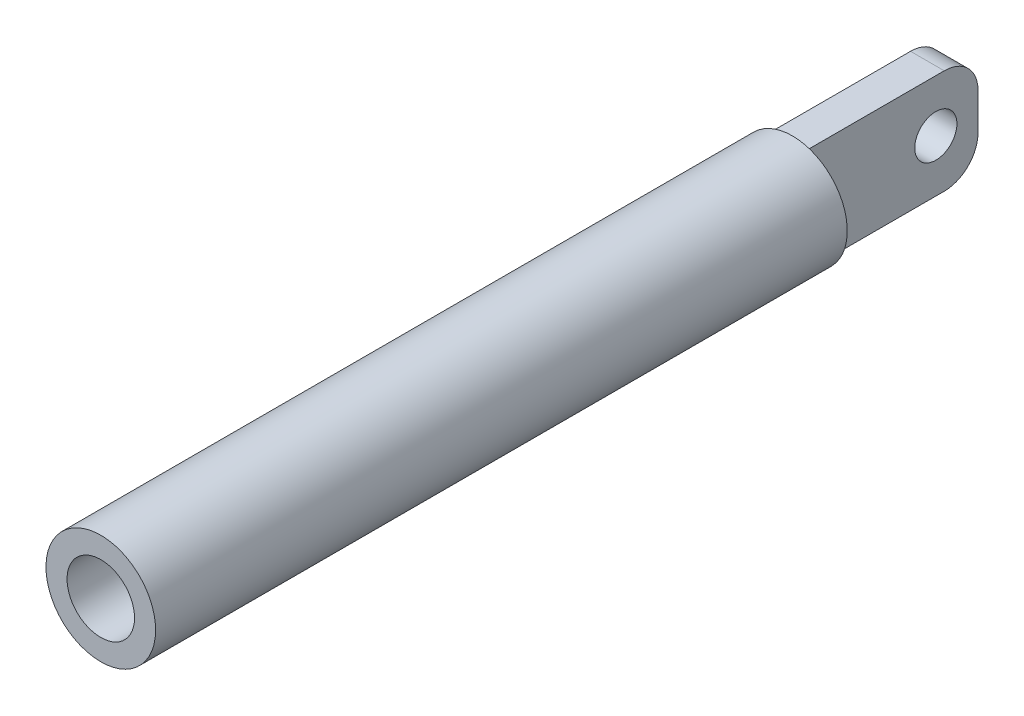
ISO-10303-21;
HEADER;
FILE_DESCRIPTION(('STEP AP214'),'2;1');
FILE_NAME('part.step','',(''),(''),'','','');
FILE_SCHEMA(('AUTOMOTIVE_DESIGN { 1 0 10303 214 1 1 1 1 }'));
ENDSEC;
DATA;
#1=APPLICATION_CONTEXT('core data for automotive mechanical design processes');
#2=APPLICATION_PROTOCOL_DEFINITION('international standard','automotive_design',2000,#1);
#3=PRODUCT_CONTEXT('',#1,'mechanical');
#4=PRODUCT('Part','Part','',(#3));
#5=PRODUCT_RELATED_PRODUCT_CATEGORY('part','',(#4));
#6=PRODUCT_DEFINITION_FORMATION('','',#4);
#7=PRODUCT_DEFINITION_CONTEXT('part definition',#1,'design');
#8=PRODUCT_DEFINITION('design','',#6,#7);
#9=PRODUCT_DEFINITION_SHAPE('','',#8);
#10=(LENGTH_UNIT() NAMED_UNIT(*) SI_UNIT(.MILLI.,.METRE.));
#11=(NAMED_UNIT(*) PLANE_ANGLE_UNIT() SI_UNIT($,.RADIAN.));
#12=(NAMED_UNIT(*) SI_UNIT($,.STERADIAN.) SOLID_ANGLE_UNIT());
#13=UNCERTAINTY_MEASURE_WITH_UNIT(LENGTH_MEASURE(1.E-05),#10,'distance_accuracy_value','');
#14=(GEOMETRIC_REPRESENTATION_CONTEXT(3) GLOBAL_UNCERTAINTY_ASSIGNED_CONTEXT((#13)) GLOBAL_UNIT_ASSIGNED_CONTEXT((#10,
#11,#12)) REPRESENTATION_CONTEXT('',''));
#15=CARTESIAN_POINT('',(0.,0.,0.));
#16=DIRECTION('',(0.,0.,1.));
#17=DIRECTION('',(1.,0.,0.));
#18=AXIS2_PLACEMENT_3D('',#15,#16,#17);
#19=CARTESIAN_POINT('',(0.,0.,-62.));
#20=DIRECTION('',(0.,0.,-1.));
#21=DIRECTION('',(-1.,0.,0.));
#22=AXIS2_PLACEMENT_3D('',#19,#20,#21);
#23=PLANE('',#22);
#24=DIRECTION('',(0.,1.,0.));
#25=VECTOR('',#24,1.);
#26=CARTESIAN_POINT('',(-2.,-6.18465843842649,-62.));
#27=LINE('',#26,#25);
#28=CARTESIAN_POINT('',(-2.,-6.18465843842649,-62.));
#29=VERTEX_POINT('',#28);
#30=CARTESIAN_POINT('',(-2.,6.18465843842649,-62.));
#31=VERTEX_POINT('',#30);
#32=EDGE_CURVE('E120',#29,#31,#27,.T.);
#33=ORIENTED_EDGE('',*,*,#32,.F.);
#34=CARTESIAN_POINT('',(0.,0.,-62.));
#35=DIRECTION('',(0.,0.,-1.));
#36=DIRECTION('',(-1.,0.,0.));
#37=AXIS2_PLACEMENT_3D('',#34,#35,#36);
#38=CIRCLE('',#37,6.5);
#39=EDGE_CURVE('E108',#29,#31,#38,.T.);
#40=ORIENTED_EDGE('',*,*,#39,.T.);
#41=EDGE_LOOP('',(#33,#40));
#42=FACE_BOUND('',#41,.T.);
#43=ADVANCED_FACE('F32',(#42),#23,.T.);
#44=DIRECTION('',(-1.,0.,0.));
#45=VECTOR('',#44,1.);
#46=CARTESIAN_POINT('',(2.,-6.18465843842649,-62.));
#47=LINE('',#46,#45);
#48=CARTESIAN_POINT('',(2.,-6.18465843842649,-62.));
#49=VERTEX_POINT('',#48);
#50=EDGE_CURVE('E116',#49,#29,#47,.T.);
#51=ORIENTED_EDGE('',*,*,#50,.F.);
#52=EDGE_CURVE('E113',#49,#29,#38,.T.);
#53=ORIENTED_EDGE('',*,*,#52,.T.);
#54=EDGE_LOOP('',(#51,#53));
#55=FACE_BOUND('',#54,.T.);
#56=ADVANCED_FACE('F169',(#55),#23,.T.);
#57=DIRECTION('',(0.,-1.,0.));
#58=VECTOR('',#57,1.);
#59=CARTESIAN_POINT('',(2.,-6.18465843842649,-62.));
#60=LINE('',#59,#58);
#61=CARTESIAN_POINT('',(2.,6.18465843842649,-62.));
#62=VERTEX_POINT('',#61);
#63=EDGE_CURVE('E87',#62,#49,#60,.T.);
#64=ORIENTED_EDGE('',*,*,#63,.F.);
#65=EDGE_CURVE('E106',#62,#49,#38,.T.);
#66=ORIENTED_EDGE('',*,*,#65,.T.);
#67=EDGE_LOOP('',(#64,#66));
#68=FACE_BOUND('',#67,.T.);
#69=ADVANCED_FACE('F115',(#68),#23,.T.);
#70=CARTESIAN_POINT('',(0.,0.,20.));
#71=DIRECTION('',(0.,0.,1.));
#72=DIRECTION('',(1.,0.,0.));
#73=AXIS2_PLACEMENT_3D('',#70,#71,#72);
#74=PLANE('',#73);
#75=CARTESIAN_POINT('',(0.,0.,20.));
#76=DIRECTION('',(0.,0.,1.));
#77=DIRECTION('',(1.,0.,0.));
#78=AXIS2_PLACEMENT_3D('',#75,#76,#77);
#79=CIRCLE('',#78,6.5);
#80=CARTESIAN_POINT('',(6.5,0.,20.));
#81=VERTEX_POINT('',#80);
#82=EDGE_CURVE('E137',#81,#81,#79,.T.);
#83=ORIENTED_EDGE('',*,*,#82,.T.);
#84=EDGE_LOOP('',(#83));
#85=FACE_BOUND('',#84,.T.);
#86=CARTESIAN_POINT('',(0.,0.,20.));
#87=DIRECTION('',(0.,0.,1.));
#88=DIRECTION('',(1.,0.,0.));
#89=AXIS2_PLACEMENT_3D('',#86,#87,#88);
#90=CIRCLE('',#89,4.);
#91=CARTESIAN_POINT('',(4.,0.,20.));
#92=VERTEX_POINT('',#91);
#93=EDGE_CURVE('E134',#92,#92,#90,.T.);
#94=ORIENTED_EDGE('',*,*,#93,.F.);
#95=EDGE_LOOP('',(#94));
#96=FACE_BOUND('',#95,.T.);
#97=ADVANCED_FACE('F198',(#85,#96),#74,.T.);
#98=CARTESIAN_POINT('',(0.,0.,20.));
#99=DIRECTION('',(0.,0.,-1.));
#100=DIRECTION('',(-1.,0.,0.));
#101=AXIS2_PLACEMENT_3D('',#98,#99,#100);
#102=CYLINDRICAL_SURFACE('',#101,6.5);
#103=ORIENTED_EDGE('',*,*,#82,.F.);
#104=EDGE_LOOP('',(#103));
#105=FACE_BOUND('',#104,.T.);
#106=EDGE_CURVE('E97',#31,#62,#38,.T.);
#107=ORIENTED_EDGE('',*,*,#106,.F.);
#108=ORIENTED_EDGE('',*,*,#39,.F.);
#109=ORIENTED_EDGE('',*,*,#52,.F.);
#110=ORIENTED_EDGE('',*,*,#65,.F.);
#111=EDGE_LOOP('',(#107,#108,#109,#110));
#112=FACE_BOUND('',#111,.T.);
#113=ADVANCED_FACE('F111',(#105,#112),#102,.T.);
#114=CARTESIAN_POINT('',(0.,0.,20.));
#115=DIRECTION('',(0.,0.,-1.));
#116=DIRECTION('',(-1.,0.,0.));
#117=AXIS2_PLACEMENT_3D('',#114,#115,#116);
#118=CYLINDRICAL_SURFACE('',#117,4.);
#119=ORIENTED_EDGE('',*,*,#93,.T.);
#120=EDGE_LOOP('',(#119));
#121=FACE_BOUND('',#120,.T.);
#122=CARTESIAN_POINT('',(0.,0.,0.));
#123=DIRECTION('',(0.,0.,1.));
#124=DIRECTION('',(1.,0.,0.));
#125=AXIS2_PLACEMENT_3D('',#122,#123,#124);
#126=CIRCLE('',#125,4.);
#127=CARTESIAN_POINT('',(4.,0.,0.));
#128=VERTEX_POINT('',#127);
#129=EDGE_CURVE('E105',#128,#128,#126,.T.);
#130=ORIENTED_EDGE('',*,*,#129,.F.);
#131=EDGE_LOOP('',(#130));
#132=FACE_BOUND('',#131,.T.);
#133=ADVANCED_FACE('F195',(#121,#132),#118,.F.);
#134=CARTESIAN_POINT('',(0.,0.,0.));
#135=DIRECTION('',(0.,0.,-1.));
#136=DIRECTION('',(-1.,0.,0.));
#137=AXIS2_PLACEMENT_3D('',#134,#135,#136);
#138=PLANE('',#137);
#139=ORIENTED_EDGE('',*,*,#129,.T.);
#140=EDGE_LOOP('',(#139));
#141=FACE_BOUND('',#140,.T.);
#142=ADVANCED_FACE('F189',(#141),#138,.F.);
#143=DIRECTION('',(1.,0.,0.));
#144=VECTOR('',#143,1.);
#145=CARTESIAN_POINT('',(2.,6.18465843842649,-62.));
#146=LINE('',#145,#144);
#147=EDGE_CURVE('E100',#31,#62,#146,.T.);
#148=ORIENTED_EDGE('',*,*,#147,.F.);
#149=ORIENTED_EDGE('',*,*,#106,.T.);
#150=EDGE_LOOP('',(#148,#149));
#151=FACE_BOUND('',#150,.T.);
#152=ADVANCED_FACE('F99',(#151),#23,.T.);
#153=CARTESIAN_POINT('',(-2.,-6.18465843842649,-82.));
#154=DIRECTION('',(1.,0.,0.));
#155=DIRECTION('',(0.,0.,-1.));
#156=AXIS2_PLACEMENT_3D('',#153,#154,#155);
#157=PLANE('',#156);
#158=CARTESIAN_POINT('',(-2.,0.,-77.));
#159=DIRECTION('',(1.,0.,0.));
#160=DIRECTION('',(0.,0.,-1.));
#161=AXIS2_PLACEMENT_3D('',#158,#159,#160);
#162=CIRCLE('',#161,2.50000000000001);
#163=CARTESIAN_POINT('',(-2.,0.,-79.5));
#164=VERTEX_POINT('',#163);
#165=EDGE_CURVE('E122',#164,#164,#162,.F.);
#166=ORIENTED_EDGE('',*,*,#165,.F.);
#167=EDGE_LOOP('',(#166));
#168=FACE_BOUND('',#167,.T.);
#169=DIRECTION('',(0.,1.,0.));
#170=VECTOR('',#169,1.);
#171=CARTESIAN_POINT('',(-2.,-6.18465843842649,-82.));
#172=LINE('',#171,#170);
#173=CARTESIAN_POINT('',(-2.,-2.18465843842649,-82.));
#174=VERTEX_POINT('',#173);
#175=CARTESIAN_POINT('',(-2.,2.18465843842649,-82.));
#176=VERTEX_POINT('',#175);
#177=EDGE_CURVE('E128',#174,#176,#172,.T.);
#178=ORIENTED_EDGE('',*,*,#177,.F.);
#179=CARTESIAN_POINT('',(-2.,-2.18465843842649,-78.));
#180=DIRECTION('',(1.,0.,0.));
#181=DIRECTION('',(0.,0.,-1.));
#182=AXIS2_PLACEMENT_3D('',#179,#180,#181);
#183=CIRCLE('',#182,4.);
#184=CARTESIAN_POINT('',(-2.,-6.18465843842649,-78.));
#185=VERTEX_POINT('',#184);
#186=EDGE_CURVE('E150',#174,#185,#183,.F.);
#187=ORIENTED_EDGE('',*,*,#186,.T.);
#188=DIRECTION('',(0.,0.,1.));
#189=VECTOR('',#188,1.);
#190=CARTESIAN_POINT('',(-2.,-6.18465843842649,-82.));
#191=LINE('',#190,#189);
#192=EDGE_CURVE('E129',#185,#29,#191,.T.);
#193=ORIENTED_EDGE('',*,*,#192,.T.);
#194=ORIENTED_EDGE('',*,*,#32,.T.);
#195=DIRECTION('',(0.,0.,1.));
#196=VECTOR('',#195,1.);
#197=CARTESIAN_POINT('',(-2.,6.18465843842649,-82.));
#198=LINE('',#197,#196);
#199=CARTESIAN_POINT('',(-2.,6.18465843842649,-78.));
#200=VERTEX_POINT('',#199);
#201=EDGE_CURVE('E91',#200,#31,#198,.T.);
#202=ORIENTED_EDGE('',*,*,#201,.F.);
#203=CARTESIAN_POINT('',(-2.,2.18465843842649,-78.));
#204=DIRECTION('',(1.,0.,0.));
#205=DIRECTION('',(0.,0.,-1.));
#206=AXIS2_PLACEMENT_3D('',#203,#204,#205);
#207=CIRCLE('',#206,4.);
#208=EDGE_CURVE('E148',#200,#176,#207,.F.);
#209=ORIENTED_EDGE('',*,*,#208,.T.);
#210=EDGE_LOOP('',(#178,#187,#193,#194,#202,#209));
#211=FACE_BOUND('',#210,.T.);
#212=ADVANCED_FACE('F164',(#168,#211),#157,.F.);
#213=CARTESIAN_POINT('',(2.,6.18465843842649,-82.));
#214=DIRECTION('',(0.,-1.,0.));
#215=DIRECTION('',(0.,0.,-1.));
#216=AXIS2_PLACEMENT_3D('',#213,#214,#215);
#217=PLANE('',#216);
#218=DIRECTION('',(0.,0.,1.));
#219=VECTOR('',#218,1.);
#220=CARTESIAN_POINT('',(2.,6.18465843842649,-82.));
#221=LINE('',#220,#219);
#222=CARTESIAN_POINT('',(2.,6.18465843842649,-78.));
#223=VERTEX_POINT('',#222);
#224=EDGE_CURVE('E83',#223,#62,#221,.T.);
#225=ORIENTED_EDGE('',*,*,#224,.F.);
#226=DIRECTION('',(1.,0.,0.));
#227=VECTOR('',#226,1.);
#228=CARTESIAN_POINT('',(2.,6.18465843842649,-78.));
#229=LINE('',#228,#227);
#230=EDGE_CURVE('E11',#223,#200,#229,.F.);
#231=ORIENTED_EDGE('',*,*,#230,.T.);
#232=ORIENTED_EDGE('',*,*,#201,.T.);
#233=ORIENTED_EDGE('',*,*,#147,.T.);
#234=EDGE_LOOP('',(#225,#231,#232,#233));
#235=FACE_BOUND('',#234,.T.);
#236=ADVANCED_FACE('F118',(#235),#217,.F.);
#237=CARTESIAN_POINT('',(2.,-6.18465843842649,-82.));
#238=DIRECTION('',(-1.,0.,0.));
#239=DIRECTION('',(0.,0.,1.));
#240=AXIS2_PLACEMENT_3D('',#237,#238,#239);
#241=PLANE('',#240);
#242=CARTESIAN_POINT('',(2.,0.,-77.));
#243=DIRECTION('',(1.,0.,0.));
#244=DIRECTION('',(0.,0.,-1.));
#245=AXIS2_PLACEMENT_3D('',#242,#243,#244);
#246=CIRCLE('',#245,2.50000000000001);
#247=CARTESIAN_POINT('',(2.,0.,-79.5));
#248=VERTEX_POINT('',#247);
#249=EDGE_CURVE('E308',#248,#248,#246,.T.);
#250=ORIENTED_EDGE('',*,*,#249,.F.);
#251=EDGE_LOOP('',(#250));
#252=FACE_BOUND('',#251,.T.);
#253=DIRECTION('',(0.,0.,1.));
#254=VECTOR('',#253,1.);
#255=CARTESIAN_POINT('',(2.,-6.18465843842649,-82.));
#256=LINE('',#255,#254);
#257=CARTESIAN_POINT('',(2.,-6.18465843842649,-78.));
#258=VERTEX_POINT('',#257);
#259=EDGE_CURVE('E92',#258,#49,#256,.T.);
#260=ORIENTED_EDGE('',*,*,#259,.F.);
#261=CARTESIAN_POINT('',(2.,-2.18465843842649,-78.));
#262=DIRECTION('',(-1.,0.,0.));
#263=DIRECTION('',(0.,0.,1.));
#264=AXIS2_PLACEMENT_3D('',#261,#262,#263);
#265=CIRCLE('',#264,4.);
#266=CARTESIAN_POINT('',(2.,-2.18465843842649,-82.));
#267=VERTEX_POINT('',#266);
#268=EDGE_CURVE('E40',#258,#267,#265,.F.);
#269=ORIENTED_EDGE('',*,*,#268,.T.);
#270=DIRECTION('',(0.,-1.,0.));
#271=VECTOR('',#270,1.);
#272=CARTESIAN_POINT('',(2.,-6.18465843842649,-82.));
#273=LINE('',#272,#271);
#274=CARTESIAN_POINT('',(2.,2.18465843842649,-82.));
#275=VERTEX_POINT('',#274);
#276=EDGE_CURVE('E131',#275,#267,#273,.T.);
#277=ORIENTED_EDGE('',*,*,#276,.F.);
#278=CARTESIAN_POINT('',(2.,2.18465843842649,-78.));
#279=DIRECTION('',(-1.,0.,0.));
#280=DIRECTION('',(0.,0.,1.));
#281=AXIS2_PLACEMENT_3D('',#278,#279,#280);
#282=CIRCLE('',#281,4.);
#283=EDGE_CURVE('E47',#275,#223,#282,.F.);
#284=ORIENTED_EDGE('',*,*,#283,.T.);
#285=ORIENTED_EDGE('',*,*,#224,.T.);
#286=ORIENTED_EDGE('',*,*,#63,.T.);
#287=EDGE_LOOP('',(#260,#269,#277,#284,#285,#286));
#288=FACE_BOUND('',#287,.T.);
#289=ADVANCED_FACE('F85',(#252,#288),#241,.F.);
#290=CARTESIAN_POINT('',(2.,-6.18465843842649,-82.));
#291=DIRECTION('',(0.,1.,0.));
#292=DIRECTION('',(0.,0.,1.));
#293=AXIS2_PLACEMENT_3D('',#290,#291,#292);
#294=PLANE('',#293);
#295=ORIENTED_EDGE('',*,*,#192,.F.);
#296=DIRECTION('',(-1.,0.,0.));
#297=VECTOR('',#296,1.);
#298=CARTESIAN_POINT('',(2.,-6.18465843842649,-78.));
#299=LINE('',#298,#297);
#300=EDGE_CURVE('E55',#185,#258,#299,.F.);
#301=ORIENTED_EDGE('',*,*,#300,.T.);
#302=ORIENTED_EDGE('',*,*,#259,.T.);
#303=ORIENTED_EDGE('',*,*,#50,.T.);
#304=EDGE_LOOP('',(#295,#301,#302,#303));
#305=FACE_BOUND('',#304,.T.);
#306=ADVANCED_FACE('F166',(#305),#294,.F.);
#307=CARTESIAN_POINT('',(0.,0.,-82.));
#308=DIRECTION('',(0.,0.,1.));
#309=DIRECTION('',(1.,0.,0.));
#310=AXIS2_PLACEMENT_3D('',#307,#308,#309);
#311=PLANE('',#310);
#312=ORIENTED_EDGE('',*,*,#276,.T.);
#313=DIRECTION('',(-1.,0.,0.));
#314=VECTOR('',#313,1.);
#315=CARTESIAN_POINT('',(0.,-2.18465843842649,-82.));
#316=LINE('',#315,#314);
#317=EDGE_CURVE('E145',#267,#174,#316,.T.);
#318=ORIENTED_EDGE('',*,*,#317,.T.);
#319=ORIENTED_EDGE('',*,*,#177,.T.);
#320=DIRECTION('',(1.,0.,0.));
#321=VECTOR('',#320,1.);
#322=CARTESIAN_POINT('',(0.,2.18465843842649,-82.));
#323=LINE('',#322,#321);
#324=EDGE_CURVE('E142',#176,#275,#323,.T.);
#325=ORIENTED_EDGE('',*,*,#324,.T.);
#326=EDGE_LOOP('',(#312,#318,#319,#325));
#327=FACE_BOUND('',#326,.T.);
#328=ADVANCED_FACE('F158',(#327),#311,.F.);
#329=CARTESIAN_POINT('',(0.,-2.18465843842649,-78.));
#330=DIRECTION('',(-1.,0.,0.));
#331=DIRECTION('',(0.,0.,1.));
#332=AXIS2_PLACEMENT_3D('',#329,#330,#331);
#333=CYLINDRICAL_SURFACE('',#332,4.);
#334=ORIENTED_EDGE('',*,*,#268,.F.);
#335=ORIENTED_EDGE('',*,*,#300,.F.);
#336=ORIENTED_EDGE('',*,*,#186,.F.);
#337=ORIENTED_EDGE('',*,*,#317,.F.);
#338=EDGE_LOOP('',(#334,#335,#336,#337));
#339=FACE_BOUND('',#338,.T.);
#340=ADVANCED_FACE('F162',(#339),#333,.T.);
#341=CARTESIAN_POINT('',(0.,2.18465843842649,-78.));
#342=DIRECTION('',(1.,0.,0.));
#343=DIRECTION('',(0.,0.,-1.));
#344=AXIS2_PLACEMENT_3D('',#341,#342,#343);
#345=CYLINDRICAL_SURFACE('',#344,4.);
#346=ORIENTED_EDGE('',*,*,#208,.F.);
#347=ORIENTED_EDGE('',*,*,#230,.F.);
#348=ORIENTED_EDGE('',*,*,#283,.F.);
#349=ORIENTED_EDGE('',*,*,#324,.F.);
#350=EDGE_LOOP('',(#346,#347,#348,#349));
#351=FACE_BOUND('',#350,.T.);
#352=ADVANCED_FACE('F34',(#351),#345,.T.);
#353=CARTESIAN_POINT('',(-9.07106781186551,0.,-77.));
#354=DIRECTION('',(1.,0.,0.));
#355=DIRECTION('',(0.,0.,-1.));
#356=AXIS2_PLACEMENT_3D('',#353,#354,#355);
#357=CYLINDRICAL_SURFACE('',#356,2.50000000000001);
#358=ORIENTED_EDGE('',*,*,#165,.T.);
#359=EDGE_LOOP('',(#358));
#360=FACE_BOUND('',#359,.T.);
#361=ORIENTED_EDGE('',*,*,#249,.T.);
#362=EDGE_LOOP('',(#361));
#363=FACE_BOUND('',#362,.T.);
#364=ADVANCED_FACE('F174',(#360,#363),#357,.F.);
#365=CLOSED_SHELL('',(#43,#56,#69,#97,#113,#133,#142,#152,#212,#236,#289,#306,#328,#340,#352,#364));
#366=MANIFOLD_SOLID_BREP('B2',#365);
#367=ADVANCED_BREP_SHAPE_REPRESENTATION('',(#18,#366),#14);
#368=SHAPE_DEFINITION_REPRESENTATION(#9,#367);
ENDSEC;
END-ISO-10303-21;
